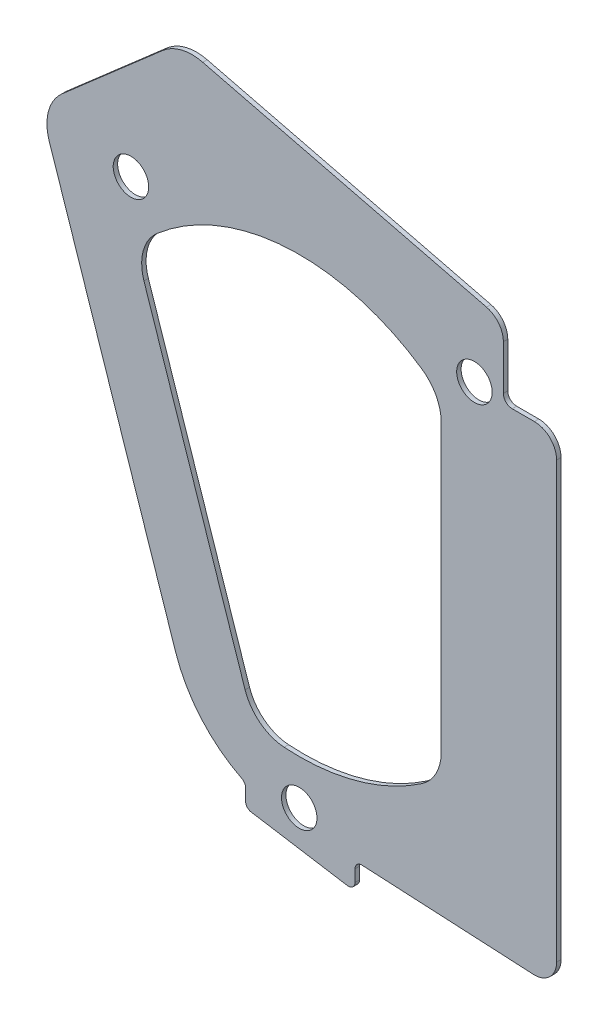
ISO-10303-21;
HEADER;
FILE_DESCRIPTION(('STEP AP214'),'2;1');
FILE_NAME('part.step','',(''),(''),'','','');
FILE_SCHEMA(('AUTOMOTIVE_DESIGN { 1 0 10303 214 1 1 1 1 }'));
ENDSEC;
DATA;
#1=APPLICATION_CONTEXT('core data for automotive mechanical design processes');
#2=APPLICATION_PROTOCOL_DEFINITION('international standard','automotive_design',2000,#1);
#3=PRODUCT_CONTEXT('',#1,'mechanical');
#4=PRODUCT('Part','Part','',(#3));
#5=PRODUCT_RELATED_PRODUCT_CATEGORY('part','',(#4));
#6=PRODUCT_DEFINITION_FORMATION('','',#4);
#7=PRODUCT_DEFINITION_CONTEXT('part definition',#1,'design');
#8=PRODUCT_DEFINITION('design','',#6,#7);
#9=PRODUCT_DEFINITION_SHAPE('','',#8);
#10=(LENGTH_UNIT() NAMED_UNIT(*) SI_UNIT(.MILLI.,.METRE.));
#11=(NAMED_UNIT(*) PLANE_ANGLE_UNIT() SI_UNIT($,.RADIAN.));
#12=(NAMED_UNIT(*) SI_UNIT($,.STERADIAN.) SOLID_ANGLE_UNIT());
#13=UNCERTAINTY_MEASURE_WITH_UNIT(LENGTH_MEASURE(1.E-05),#10,'distance_accuracy_value','');
#14=(GEOMETRIC_REPRESENTATION_CONTEXT(3) GLOBAL_UNCERTAINTY_ASSIGNED_CONTEXT((#13)) GLOBAL_UNIT_ASSIGNED_CONTEXT((#10,
#11,#12)) REPRESENTATION_CONTEXT('',''));
#15=CARTESIAN_POINT('',(0.,0.,0.));
#16=DIRECTION('',(0.,0.,1.));
#17=DIRECTION('',(1.,0.,0.));
#18=AXIS2_PLACEMENT_3D('',#15,#16,#17);
#19=CARTESIAN_POINT('',(0.579585172967806,-32.9763193057377,1.));
#20=DIRECTION('',(0.,0.,1.));
#21=DIRECTION('',(1.,0.,0.));
#22=AXIS2_PLACEMENT_3D('',#19,#20,#21);
#23=PLANE('',#22);
#24=CARTESIAN_POINT('',(-37.9244689715056,45.1966221440199,1.));
#25=DIRECTION('',(0.,0.,1.));
#26=DIRECTION('',(1.,0.,0.));
#27=AXIS2_PLACEMENT_3D('',#24,#25,#26);
#28=CIRCLE('',#27,4.);
#29=CARTESIAN_POINT('',(-33.9244689715056,45.1966221440199,1.));
#30=VERTEX_POINT('',#29);
#31=EDGE_CURVE('E328',#30,#30,#28,.T.);
#32=ORIENTED_EDGE('',*,*,#31,.F.);
#33=EDGE_LOOP('',(#32));
#34=FACE_BOUND('',#33,.T.);
#35=CARTESIAN_POINT('',(0.579585172967806,-32.9763193057377,1.));
#36=DIRECTION('',(0.,0.,1.));
#37=DIRECTION('',(1.,0.,0.));
#38=AXIS2_PLACEMENT_3D('',#35,#36,#37);
#39=CIRCLE('',#38,30.);
#40=CARTESIAN_POINT('',(-27.8813666018187,-42.4617936783389,1.));
#41=VERTEX_POINT('',#40);
#42=CARTESIAN_POINT('',(-12.9237937339093,-59.7654730455875,1.));
#43=VERTEX_POINT('',#42);
#44=EDGE_CURVE('E344',#41,#43,#39,.T.);
#45=ORIENTED_EDGE('',*,*,#44,.T.);
#46=CARTESIAN_POINT('',(-13.5989626792531,-61.10493073258,1.));
#47=DIRECTION('',(0.,0.,-1.));
#48=DIRECTION('',(1.,0.,0.));
#49=AXIS2_PLACEMENT_3D('',#46,#47,#48);
#50=CIRCLE('',#49,1.49999999999999);
#51=CARTESIAN_POINT('',(-12.0989626792531,-61.10493073258,1.));
#52=VERTEX_POINT('',#51);
#53=EDGE_CURVE('E348',#43,#52,#50,.T.);
#54=ORIENTED_EDGE('',*,*,#53,.T.);
#55=DIRECTION('',(0.,-1.,0.));
#56=VECTOR('',#55,1.);
#57=CARTESIAN_POINT('',(-12.0989626792531,-61.10493073258,1.));
#58=LINE('',#57,#56);
#59=CARTESIAN_POINT('',(-12.098962679253,-63.7624567480316,1.));
#60=VERTEX_POINT('',#59);
#61=EDGE_CURVE('E352',#52,#60,#58,.T.);
#62=ORIENTED_EDGE('',*,*,#61,.T.);
#63=CARTESIAN_POINT('',(-10.598962679253,-63.7624567480316,1.));
#64=DIRECTION('',(0.,0.,1.));
#65=DIRECTION('',(1.,0.,0.));
#66=AXIS2_PLACEMENT_3D('',#63,#64,#65);
#67=CIRCLE('',#66,1.50000000000003);
#68=CARTESIAN_POINT('',(-10.838962679253,-65.243132269542,1.));
#69=VERTEX_POINT('',#68);
#70=EDGE_CURVE('E355',#60,#69,#67,.T.);
#71=ORIENTED_EDGE('',*,*,#70,.T.);
#72=DIRECTION('',(0.987117014340245,-0.16,0.));
#73=VECTOR('',#72,1.);
#74=CARTESIAN_POINT('',(-10.838962679253,-65.243132269542,1.));
#75=LINE('',#74,#73);
#76=CARTESIAN_POINT('',(10.8389626792529,-68.756867730458,1.));
#77=VERTEX_POINT('',#76);
#78=EDGE_CURVE('E358',#69,#77,#75,.T.);
#79=ORIENTED_EDGE('',*,*,#78,.T.);
#80=CARTESIAN_POINT('',(11.078962679253,-67.2761922089477,1.));
#81=DIRECTION('',(0.,0.,1.));
#82=DIRECTION('',(1.,0.,0.));
#83=AXIS2_PLACEMENT_3D('',#80,#81,#82);
#84=CIRCLE('',#83,1.50000000000002);
#85=CARTESIAN_POINT('',(12.578962679253,-67.2761922089477,1.));
#86=VERTEX_POINT('',#85);
#87=EDGE_CURVE('E361',#77,#86,#84,.T.);
#88=ORIENTED_EDGE('',*,*,#87,.T.);
#89=DIRECTION('',(0.,1.,0.));
#90=VECTOR('',#89,1.);
#91=CARTESIAN_POINT('',(12.578962679253,-67.2761922089477,1.));
#92=LINE('',#91,#90);
#93=CARTESIAN_POINT('',(12.578962679253,-64.6186661934961,1.));
#94=VERTEX_POINT('',#93);
#95=EDGE_CURVE('E364',#86,#94,#92,.T.);
#96=ORIENTED_EDGE('',*,*,#95,.T.);
#97=CARTESIAN_POINT('',(14.078962679253,-64.6186661934961,1.));
#98=DIRECTION('',(0.,0.,-1.));
#99=DIRECTION('',(-1.,0.,0.));
#100=AXIS2_PLACEMENT_3D('',#97,#98,#99);
#101=CIRCLE('',#100,1.5);
#102=CARTESIAN_POINT('',(14.1566097329633,-63.1206772299019,1.));
#103=VERTEX_POINT('',#102);
#104=EDGE_CURVE('E367',#94,#103,#101,.T.);
#105=ORIENTED_EDGE('',*,*,#104,.T.);
#106=DIRECTION('',(0.998659309062819,-0.0517647024735334,0.));
#107=VECTOR('',#106,1.);
#108=CARTESIAN_POINT('',(14.1566097329633,-63.1206772299019,1.));
#109=LINE('',#108,#107);
#110=CARTESIAN_POINT('',(52.7411764876323,-65.1206772299019,1.));
#111=VERTEX_POINT('',#110);
#112=EDGE_CURVE('E370',#103,#111,#109,.T.);
#113=ORIENTED_EDGE('',*,*,#112,.T.);
#114=CARTESIAN_POINT('',(53.,-60.1273806845878,1.));
#115=DIRECTION('',(0.,0.,1.));
#116=DIRECTION('',(1.,0.,0.));
#117=AXIS2_PLACEMENT_3D('',#114,#115,#116);
#118=CIRCLE('',#117,5.);
#119=CARTESIAN_POINT('',(58.,-60.1273806845878,1.));
#120=VERTEX_POINT('',#119);
#121=EDGE_CURVE('E373',#111,#120,#118,.T.);
#122=ORIENTED_EDGE('',*,*,#121,.T.);
#123=DIRECTION('',(0.,1.,0.));
#124=VECTOR('',#123,1.);
#125=CARTESIAN_POINT('',(58.,-60.1273806845878,1.));
#126=LINE('',#125,#124);
#127=CARTESIAN_POINT('',(58.,37.8793227700981,1.));
#128=VERTEX_POINT('',#127);
#129=EDGE_CURVE('E376',#120,#128,#126,.T.);
#130=ORIENTED_EDGE('',*,*,#129,.T.);
#131=CARTESIAN_POINT('',(53.,37.8793227700981,1.));
#132=DIRECTION('',(0.,0.,1.));
#133=DIRECTION('',(1.,0.,0.));
#134=AXIS2_PLACEMENT_3D('',#131,#132,#133);
#135=CIRCLE('',#134,4.99999999999999);
#136=CARTESIAN_POINT('',(53.,42.8793227700981,1.));
#137=VERTEX_POINT('',#136);
#138=EDGE_CURVE('E379',#128,#137,#135,.T.);
#139=ORIENTED_EDGE('',*,*,#138,.T.);
#140=DIRECTION('',(-1.,0.,0.));
#141=VECTOR('',#140,1.);
#142=CARTESIAN_POINT('',(53.,42.8793227700981,1.));
#143=LINE('',#142,#141);
#144=CARTESIAN_POINT('',(48.,42.8793227700981,1.));
#145=VERTEX_POINT('',#144);
#146=EDGE_CURVE('E382',#137,#145,#143,.T.);
#147=ORIENTED_EDGE('',*,*,#146,.T.);
#148=CARTESIAN_POINT('',(48.,44.8793227700981,1.));
#149=DIRECTION('',(0.,0.,-1.));
#150=DIRECTION('',(-1.,0.,0.));
#151=AXIS2_PLACEMENT_3D('',#148,#149,#150);
#152=CIRCLE('',#151,2.);
#153=CARTESIAN_POINT('',(46.,44.8793227700981,1.));
#154=VERTEX_POINT('',#153);
#155=EDGE_CURVE('E385',#145,#154,#152,.T.);
#156=ORIENTED_EDGE('',*,*,#155,.T.);
#157=DIRECTION('',(0.,1.,0.));
#158=VECTOR('',#157,1.);
#159=CARTESIAN_POINT('',(46.,44.8793227700981,1.));
#160=LINE('',#159,#158);
#161=CARTESIAN_POINT('',(46.,54.9649159638041,1.));
#162=VERTEX_POINT('',#161);
#163=EDGE_CURVE('E388',#154,#162,#160,.T.);
#164=ORIENTED_EDGE('',*,*,#163,.T.);
#165=CARTESIAN_POINT('',(41.,54.9649159638041,1.));
#166=DIRECTION('',(0.,0.,1.));
#167=DIRECTION('',(1.,0.,0.));
#168=AXIS2_PLACEMENT_3D('',#165,#166,#167);
#169=CIRCLE('',#168,4.99999999999999);
#170=CARTESIAN_POINT('',(42.2,59.8187804036087,1.));
#171=VERTEX_POINT('',#170);
#172=EDGE_CURVE('E391',#162,#171,#169,.T.);
#173=ORIENTED_EDGE('',*,*,#172,.T.);
#174=DIRECTION('',(-0.970772887960928,0.24,0.));
#175=VECTOR('',#174,1.);
#176=CARTESIAN_POINT('',(42.2,59.8187804036087,1.));
#177=LINE('',#176,#175);
#178=CARTESIAN_POINT('',(-21.7544428066554,75.6299618487739,1.));
#179=VERTEX_POINT('',#178);
#180=EDGE_CURVE('E394',#171,#179,#177,.T.);
#181=ORIENTED_EDGE('',*,*,#180,.T.);
#182=CARTESIAN_POINT('',(-24.1544428066554,65.9222329691647,1.));
#183=DIRECTION('',(0.,0.,1.));
#184=DIRECTION('',(1.,0.,0.));
#185=AXIS2_PLACEMENT_3D('',#182,#183,#184);
#186=CIRCLE('',#185,10.);
#187=CARTESIAN_POINT('',(-30.7299653165481,73.4563224112866,1.));
#188=VERTEX_POINT('',#187);
#189=EDGE_CURVE('E397',#179,#188,#186,.T.);
#190=ORIENTED_EDGE('',*,*,#189,.T.);
#191=DIRECTION('',(-0.753408944212199,-0.657552250989273,0.));
#192=VECTOR('',#191,1.);
#193=CARTESIAN_POINT('',(-30.7299653165481,73.4563224112866,1.));
#194=LINE('',#193,#192);
#195=CARTESIAN_POINT('',(-53.4342431278338,53.6407241275319,1.));
#196=VERTEX_POINT('',#195);
#197=EDGE_CURVE('E400',#188,#196,#194,.T.);
#198=ORIENTED_EDGE('',*,*,#197,.T.);
#199=CARTESIAN_POINT('',(-46.8587206179411,46.1066346854099,1.));
#200=DIRECTION('',(0.,0.,1.));
#201=DIRECTION('',(1.,0.,0.));
#202=AXIS2_PLACEMENT_3D('',#199,#200,#201);
#203=CIRCLE('',#202,10.);
#204=CARTESIAN_POINT('',(-56.3457045428699,42.9448098945428,1.));
#205=VERTEX_POINT('',#204);
#206=EDGE_CURVE('E403',#196,#205,#203,.T.);
#207=ORIENTED_EDGE('',*,*,#206,.T.);
#208=DIRECTION('',(0.316182479086709,-0.948698392492884,0.));
#209=VECTOR('',#208,1.);
#210=CARTESIAN_POINT('',(-56.3457045428699,42.9448098945428,1.));
#211=LINE('',#210,#209);
#212=EDGE_CURVE('E406',#205,#41,#211,.T.);
#213=ORIENTED_EDGE('',*,*,#212,.T.);
#214=EDGE_LOOP('',(#45,#54,#62,#71,#79,#88,#96,#105,#113,#122,#130,#139,#147,#156,#164,#173,
#181,#190,#198,#207,#213));
#215=FACE_BOUND('',#214,.T.);
#216=CARTESIAN_POINT('',(0.,-59.,1.));
#217=DIRECTION('',(0.,0.,1.));
#218=DIRECTION('',(1.,0.,0.));
#219=AXIS2_PLACEMENT_3D('',#216,#217,#218);
#220=CIRCLE('',#219,4.);
#221=CARTESIAN_POINT('',(4.,-59.,1.));
#222=VERTEX_POINT('',#221);
#223=EDGE_CURVE('E336',#222,#222,#220,.T.);
#224=ORIENTED_EDGE('',*,*,#223,.F.);
#225=EDGE_LOOP('',(#224));
#226=FACE_BOUND('',#225,.T.);
#227=CARTESIAN_POINT('',(39.4787057751724,43.8455447031665,1.));
#228=DIRECTION('',(0.,0.,1.));
#229=DIRECTION('',(1.,0.,0.));
#230=AXIS2_PLACEMENT_3D('',#227,#228,#229);
#231=CIRCLE('',#230,4.00000000000001);
#232=CARTESIAN_POINT('',(43.4787057751724,43.8455447031665,1.));
#233=VERTEX_POINT('',#232);
#234=EDGE_CURVE('E320',#233,#233,#231,.T.);
#235=ORIENTED_EDGE('',*,*,#234,.F.);
#236=EDGE_LOOP('',(#235));
#237=FACE_BOUND('',#236,.T.);
#238=DIRECTION('',(0.,1.,0.));
#239=VECTOR('',#238,1.);
#240=CARTESIAN_POINT('',(32.,32.2024843762092,1.));
#241=LINE('',#240,#239);
#242=CARTESIAN_POINT('',(32.,-32.2024843762092,1.));
#243=VERTEX_POINT('',#242);
#244=CARTESIAN_POINT('',(32.,32.2024843762092,1.));
#245=VERTEX_POINT('',#244);
#246=EDGE_CURVE('E240',#243,#245,#241,.T.);
#247=ORIENTED_EDGE('',*,*,#246,.F.);
#248=CARTESIAN_POINT('',(22.,-32.2024843762092,1.));
#249=DIRECTION('',(0.,0.,1.));
#250=DIRECTION('',(-1.,0.,0.));
#251=AXIS2_PLACEMENT_3D('',#248,#249,#250);
#252=CIRCLE('',#251,10.);
#253=CARTESIAN_POINT('',(27.6410256410257,-40.4595316521603,1.));
#254=VERTEX_POINT('',#253);
#255=EDGE_CURVE('E231',#254,#243,#252,.T.);
#256=ORIENTED_EDGE('',*,*,#255,.F.);
#257=CARTESIAN_POINT('',(0.,0.,1.));
#258=DIRECTION('',(0.,0.,1.));
#259=DIRECTION('',(1.,0.,0.));
#260=AXIS2_PLACEMENT_3D('',#257,#258,#259);
#261=CIRCLE('',#260,49.);
#262=CARTESIAN_POINT('',(-3.41083723846886,-48.8811434945284,1.));
#263=VERTEX_POINT('',#262);
#264=EDGE_CURVE('E272',#263,#254,#261,.T.);
#265=ORIENTED_EDGE('',*,*,#264,.F.);
#266=CARTESIAN_POINT('',(-2.71474800612827,-38.9053999242165,1.));
#267=DIRECTION('',(0.,0.,1.));
#268=DIRECTION('',(1.,0.,0.));
#269=AXIS2_PLACEMENT_3D('',#266,#267,#268);
#270=CIRCLE('',#269,10.);
#271=CARTESIAN_POINT('',(-12.2017319310571,-42.0672247150835,1.));
#272=VERTEX_POINT('',#271);
#273=EDGE_CURVE('E269',#272,#263,#270,.T.);
#274=ORIENTED_EDGE('',*,*,#273,.F.);
#275=DIRECTION('',(0.316182479086709,-0.948698392492884,0.));
#276=VECTOR('',#275,1.);
#277=CARTESIAN_POINT('',(-34.9992061625363,26.3360821941874,1.));
#278=LINE('',#277,#276);
#279=CARTESIAN_POINT('',(-34.9992061625363,26.3360821941874,1.));
#280=VERTEX_POINT('',#279);
#281=EDGE_CURVE('E266',#280,#272,#278,.T.);
#282=ORIENTED_EDGE('',*,*,#281,.F.);
#283=CARTESIAN_POINT('',(-25.5122222376075,29.4979069850545,1.));
#284=DIRECTION('',(0.,0.,1.));
#285=DIRECTION('',(-1.,0.,0.));
#286=AXIS2_PLACEMENT_3D('',#283,#284,#285);
#287=CIRCLE('',#286,10.);
#288=CARTESIAN_POINT('',(-32.0538176831478,37.0614728786582,1.));
#289=VERTEX_POINT('',#288);
#290=EDGE_CURVE('E263',#289,#280,#287,.T.);
#291=ORIENTED_EDGE('',*,*,#290,.F.);
#292=CARTESIAN_POINT('',(0.,0.,1.));
#293=DIRECTION('',(0.,0.,1.));
#294=DIRECTION('',(1.,0.,0.));
#295=AXIS2_PLACEMENT_3D('',#292,#293,#294);
#296=CIRCLE('',#295,49.);
#297=CARTESIAN_POINT('',(27.6410256410256,40.4595316521603,1.));
#298=VERTEX_POINT('',#297);
#299=EDGE_CURVE('E258',#298,#289,#296,.T.);
#300=ORIENTED_EDGE('',*,*,#299,.F.);
#301=CARTESIAN_POINT('',(22.,32.2024843762092,1.));
#302=DIRECTION('',(0.,0.,1.));
#303=DIRECTION('',(1.,0.,0.));
#304=AXIS2_PLACEMENT_3D('',#301,#302,#303);
#305=CIRCLE('',#304,10.);
#306=EDGE_CURVE('E254',#245,#298,#305,.T.);
#307=ORIENTED_EDGE('',*,*,#306,.F.);
#308=EDGE_LOOP('',(#247,#256,#265,#274,#282,#291,#300,#307));
#309=FACE_BOUND('',#308,.T.);
#310=ADVANCED_FACE('F39',(#34,#215,#226,#237,#309),#23,.T.);
#311=CARTESIAN_POINT('',(0.579585172967806,-32.9763193057377,0.));
#312=DIRECTION('',(0.,0.,1.));
#313=DIRECTION('',(1.,0.,0.));
#314=AXIS2_PLACEMENT_3D('',#311,#312,#313);
#315=PLANE('',#314);
#316=CARTESIAN_POINT('',(39.4787057751724,43.8455447031665,0.));
#317=DIRECTION('',(0.,0.,1.));
#318=DIRECTION('',(1.,0.,0.));
#319=AXIS2_PLACEMENT_3D('',#316,#317,#318);
#320=CIRCLE('',#319,4.00000000000001);
#321=CARTESIAN_POINT('',(43.4787057751724,43.8455447031665,0.));
#322=VERTEX_POINT('',#321);
#323=EDGE_CURVE('E249',#322,#322,#320,.T.);
#324=ORIENTED_EDGE('',*,*,#323,.T.);
#325=EDGE_LOOP('',(#324));
#326=FACE_BOUND('',#325,.T.);
#327=CARTESIAN_POINT('',(-37.9244689715056,45.1966221440199,0.));
#328=DIRECTION('',(0.,0.,1.));
#329=DIRECTION('',(1.,0.,0.));
#330=AXIS2_PLACEMENT_3D('',#327,#328,#329);
#331=CIRCLE('',#330,4.);
#332=CARTESIAN_POINT('',(-33.9244689715056,45.1966221440199,0.));
#333=VERTEX_POINT('',#332);
#334=EDGE_CURVE('E324',#333,#333,#331,.T.);
#335=ORIENTED_EDGE('',*,*,#334,.T.);
#336=EDGE_LOOP('',(#335));
#337=FACE_BOUND('',#336,.T.);
#338=CARTESIAN_POINT('',(0.,-59.,0.));
#339=DIRECTION('',(0.,0.,1.));
#340=DIRECTION('',(1.,0.,0.));
#341=AXIS2_PLACEMENT_3D('',#338,#339,#340);
#342=CIRCLE('',#341,4.);
#343=CARTESIAN_POINT('',(4.,-59.,0.));
#344=VERTEX_POINT('',#343);
#345=EDGE_CURVE('E332',#344,#344,#342,.T.);
#346=ORIENTED_EDGE('',*,*,#345,.T.);
#347=EDGE_LOOP('',(#346));
#348=FACE_BOUND('',#347,.T.);
#349=CARTESIAN_POINT('',(0.579585172967806,-32.9763193057377,0.));
#350=DIRECTION('',(0.,0.,1.));
#351=DIRECTION('',(1.,0.,0.));
#352=AXIS2_PLACEMENT_3D('',#349,#350,#351);
#353=CIRCLE('',#352,30.);
#354=CARTESIAN_POINT('',(-27.8813666018187,-42.4617936783389,0.));
#355=VERTEX_POINT('',#354);
#356=CARTESIAN_POINT('',(-12.9237937339093,-59.7654730455875,0.));
#357=VERTEX_POINT('',#356);
#358=EDGE_CURVE('E340',#355,#357,#353,.T.);
#359=ORIENTED_EDGE('',*,*,#358,.F.);
#360=DIRECTION('',(0.316182479086709,-0.948698392492884,0.));
#361=VECTOR('',#360,1.);
#362=CARTESIAN_POINT('',(-56.3457045428699,42.9448098945428,0.));
#363=LINE('',#362,#361);
#364=CARTESIAN_POINT('',(-56.3457045428699,42.9448098945428,0.));
#365=VERTEX_POINT('',#364);
#366=EDGE_CURVE('E349',#365,#355,#363,.T.);
#367=ORIENTED_EDGE('',*,*,#366,.F.);
#368=CARTESIAN_POINT('',(-46.8587206179411,46.1066346854099,0.));
#369=DIRECTION('',(0.,0.,1.));
#370=DIRECTION('',(1.,0.,0.));
#371=AXIS2_PLACEMENT_3D('',#368,#369,#370);
#372=CIRCLE('',#371,10.);
#373=CARTESIAN_POINT('',(-53.4342431278338,53.6407241275319,0.));
#374=VERTEX_POINT('',#373);
#375=EDGE_CURVE('E467',#374,#365,#372,.T.);
#376=ORIENTED_EDGE('',*,*,#375,.F.);
#377=DIRECTION('',(-0.753408944212199,-0.657552250989273,0.));
#378=VECTOR('',#377,1.);
#379=CARTESIAN_POINT('',(-30.7299653165481,73.4563224112866,0.));
#380=LINE('',#379,#378);
#381=CARTESIAN_POINT('',(-30.7299653165481,73.4563224112866,0.));
#382=VERTEX_POINT('',#381);
#383=EDGE_CURVE('E464',#382,#374,#380,.T.);
#384=ORIENTED_EDGE('',*,*,#383,.F.);
#385=CARTESIAN_POINT('',(-24.1544428066554,65.9222329691647,0.));
#386=DIRECTION('',(0.,0.,1.));
#387=DIRECTION('',(1.,0.,0.));
#388=AXIS2_PLACEMENT_3D('',#385,#386,#387);
#389=CIRCLE('',#388,10.);
#390=CARTESIAN_POINT('',(-21.7544428066554,75.6299618487739,0.));
#391=VERTEX_POINT('',#390);
#392=EDGE_CURVE('E461',#391,#382,#389,.T.);
#393=ORIENTED_EDGE('',*,*,#392,.F.);
#394=DIRECTION('',(-0.970772887960928,0.24,0.));
#395=VECTOR('',#394,1.);
#396=CARTESIAN_POINT('',(42.2,59.8187804036087,0.));
#397=LINE('',#396,#395);
#398=CARTESIAN_POINT('',(42.2,59.8187804036087,0.));
#399=VERTEX_POINT('',#398);
#400=EDGE_CURVE('E458',#399,#391,#397,.T.);
#401=ORIENTED_EDGE('',*,*,#400,.F.);
#402=CARTESIAN_POINT('',(41.,54.9649159638041,0.));
#403=DIRECTION('',(0.,0.,1.));
#404=DIRECTION('',(1.,0.,0.));
#405=AXIS2_PLACEMENT_3D('',#402,#403,#404);
#406=CIRCLE('',#405,4.99999999999999);
#407=CARTESIAN_POINT('',(46.,54.9649159638041,0.));
#408=VERTEX_POINT('',#407);
#409=EDGE_CURVE('E455',#408,#399,#406,.T.);
#410=ORIENTED_EDGE('',*,*,#409,.F.);
#411=DIRECTION('',(0.,1.,0.));
#412=VECTOR('',#411,1.);
#413=CARTESIAN_POINT('',(46.,44.8793227700981,0.));
#414=LINE('',#413,#412);
#415=CARTESIAN_POINT('',(46.,44.8793227700981,0.));
#416=VERTEX_POINT('',#415);
#417=EDGE_CURVE('E452',#416,#408,#414,.T.);
#418=ORIENTED_EDGE('',*,*,#417,.F.);
#419=CARTESIAN_POINT('',(48.,44.8793227700981,0.));
#420=DIRECTION('',(0.,0.,-1.));
#421=DIRECTION('',(-1.,0.,0.));
#422=AXIS2_PLACEMENT_3D('',#419,#420,#421);
#423=CIRCLE('',#422,2.);
#424=CARTESIAN_POINT('',(48.,42.8793227700981,0.));
#425=VERTEX_POINT('',#424);
#426=EDGE_CURVE('E449',#425,#416,#423,.T.);
#427=ORIENTED_EDGE('',*,*,#426,.F.);
#428=DIRECTION('',(-1.,0.,0.));
#429=VECTOR('',#428,1.);
#430=CARTESIAN_POINT('',(53.,42.8793227700981,0.));
#431=LINE('',#430,#429);
#432=CARTESIAN_POINT('',(53.,42.8793227700981,0.));
#433=VERTEX_POINT('',#432);
#434=EDGE_CURVE('E446',#433,#425,#431,.T.);
#435=ORIENTED_EDGE('',*,*,#434,.F.);
#436=CARTESIAN_POINT('',(53.,37.8793227700981,0.));
#437=DIRECTION('',(0.,0.,1.));
#438=DIRECTION('',(1.,0.,0.));
#439=AXIS2_PLACEMENT_3D('',#436,#437,#438);
#440=CIRCLE('',#439,4.99999999999999);
#441=CARTESIAN_POINT('',(58.,37.8793227700981,0.));
#442=VERTEX_POINT('',#441);
#443=EDGE_CURVE('E443',#442,#433,#440,.T.);
#444=ORIENTED_EDGE('',*,*,#443,.F.);
#445=DIRECTION('',(0.,1.,0.));
#446=VECTOR('',#445,1.);
#447=CARTESIAN_POINT('',(58.,-60.1273806845878,0.));
#448=LINE('',#447,#446);
#449=CARTESIAN_POINT('',(58.,-60.1273806845878,0.));
#450=VERTEX_POINT('',#449);
#451=EDGE_CURVE('E440',#450,#442,#448,.T.);
#452=ORIENTED_EDGE('',*,*,#451,.F.);
#453=CARTESIAN_POINT('',(53.,-60.1273806845878,0.));
#454=DIRECTION('',(0.,0.,1.));
#455=DIRECTION('',(1.,0.,0.));
#456=AXIS2_PLACEMENT_3D('',#453,#454,#455);
#457=CIRCLE('',#456,5.);
#458=CARTESIAN_POINT('',(52.7411764876323,-65.1206772299019,0.));
#459=VERTEX_POINT('',#458);
#460=EDGE_CURVE('E437',#459,#450,#457,.T.);
#461=ORIENTED_EDGE('',*,*,#460,.F.);
#462=DIRECTION('',(0.998659309062819,-0.0517647024735334,0.));
#463=VECTOR('',#462,1.);
#464=CARTESIAN_POINT('',(14.1566097329633,-63.1206772299019,0.));
#465=LINE('',#464,#463);
#466=CARTESIAN_POINT('',(14.1566097329633,-63.1206772299019,0.));
#467=VERTEX_POINT('',#466);
#468=EDGE_CURVE('E434',#467,#459,#465,.T.);
#469=ORIENTED_EDGE('',*,*,#468,.F.);
#470=CARTESIAN_POINT('',(14.078962679253,-64.6186661934961,0.));
#471=DIRECTION('',(0.,0.,-1.));
#472=DIRECTION('',(-1.,0.,0.));
#473=AXIS2_PLACEMENT_3D('',#470,#471,#472);
#474=CIRCLE('',#473,1.5);
#475=CARTESIAN_POINT('',(12.578962679253,-64.6186661934961,0.));
#476=VERTEX_POINT('',#475);
#477=EDGE_CURVE('E431',#476,#467,#474,.T.);
#478=ORIENTED_EDGE('',*,*,#477,.F.);
#479=DIRECTION('',(0.,1.,0.));
#480=VECTOR('',#479,1.);
#481=CARTESIAN_POINT('',(12.578962679253,-67.2761922089477,0.));
#482=LINE('',#481,#480);
#483=CARTESIAN_POINT('',(12.578962679253,-67.2761922089477,0.));
#484=VERTEX_POINT('',#483);
#485=EDGE_CURVE('E428',#484,#476,#482,.T.);
#486=ORIENTED_EDGE('',*,*,#485,.F.);
#487=CARTESIAN_POINT('',(11.078962679253,-67.2761922089477,0.));
#488=DIRECTION('',(0.,0.,1.));
#489=DIRECTION('',(1.,0.,0.));
#490=AXIS2_PLACEMENT_3D('',#487,#488,#489);
#491=CIRCLE('',#490,1.50000000000002);
#492=CARTESIAN_POINT('',(10.8389626792529,-68.756867730458,0.));
#493=VERTEX_POINT('',#492);
#494=EDGE_CURVE('E425',#493,#484,#491,.T.);
#495=ORIENTED_EDGE('',*,*,#494,.F.);
#496=DIRECTION('',(0.987117014340245,-0.16,0.));
#497=VECTOR('',#496,1.);
#498=CARTESIAN_POINT('',(-10.838962679253,-65.243132269542,0.));
#499=LINE('',#498,#497);
#500=CARTESIAN_POINT('',(-10.838962679253,-65.243132269542,0.));
#501=VERTEX_POINT('',#500);
#502=EDGE_CURVE('E422',#501,#493,#499,.T.);
#503=ORIENTED_EDGE('',*,*,#502,.F.);
#504=CARTESIAN_POINT('',(-10.598962679253,-63.7624567480316,0.));
#505=DIRECTION('',(0.,0.,1.));
#506=DIRECTION('',(1.,0.,0.));
#507=AXIS2_PLACEMENT_3D('',#504,#505,#506);
#508=CIRCLE('',#507,1.50000000000003);
#509=CARTESIAN_POINT('',(-12.098962679253,-63.7624567480316,0.));
#510=VERTEX_POINT('',#509);
#511=EDGE_CURVE('E419',#510,#501,#508,.T.);
#512=ORIENTED_EDGE('',*,*,#511,.F.);
#513=DIRECTION('',(0.,-1.,0.));
#514=VECTOR('',#513,1.);
#515=CARTESIAN_POINT('',(-12.0989626792531,-61.10493073258,0.));
#516=LINE('',#515,#514);
#517=CARTESIAN_POINT('',(-12.0989626792531,-61.10493073258,0.));
#518=VERTEX_POINT('',#517);
#519=EDGE_CURVE('E416',#518,#510,#516,.T.);
#520=ORIENTED_EDGE('',*,*,#519,.F.);
#521=CARTESIAN_POINT('',(-13.5989626792531,-61.10493073258,0.));
#522=DIRECTION('',(0.,0.,-1.));
#523=DIRECTION('',(1.,0.,0.));
#524=AXIS2_PLACEMENT_3D('',#521,#522,#523);
#525=CIRCLE('',#524,1.49999999999999);
#526=EDGE_CURVE('E413',#357,#518,#525,.T.);
#527=ORIENTED_EDGE('',*,*,#526,.F.);
#528=EDGE_LOOP('',(#359,#367,#376,#384,#393,#401,#410,#418,#427,#435,#444,#452,#461,#469,#478,
#486,#495,#503,#512,#520,#527));
#529=FACE_BOUND('',#528,.T.);
#530=CARTESIAN_POINT('',(22.,-32.2024843762092,0.));
#531=DIRECTION('',(0.,0.,1.));
#532=DIRECTION('',(-1.,0.,0.));
#533=AXIS2_PLACEMENT_3D('',#530,#531,#532);
#534=CIRCLE('',#533,10.);
#535=CARTESIAN_POINT('',(27.6410256410257,-40.4595316521603,0.));
#536=VERTEX_POINT('',#535);
#537=CARTESIAN_POINT('',(32.,-32.2024843762092,0.));
#538=VERTEX_POINT('',#537);
#539=EDGE_CURVE('E63',#536,#538,#534,.T.);
#540=ORIENTED_EDGE('',*,*,#539,.T.);
#541=DIRECTION('',(0.,1.,0.));
#542=VECTOR('',#541,1.);
#543=CARTESIAN_POINT('',(32.,32.2024843762092,0.));
#544=LINE('',#543,#542);
#545=CARTESIAN_POINT('',(32.,32.2024843762092,0.));
#546=VERTEX_POINT('',#545);
#547=EDGE_CURVE('E247',#538,#546,#544,.T.);
#548=ORIENTED_EDGE('',*,*,#547,.T.);
#549=CARTESIAN_POINT('',(22.,32.2024843762092,0.));
#550=DIRECTION('',(0.,0.,1.));
#551=DIRECTION('',(1.,0.,0.));
#552=AXIS2_PLACEMENT_3D('',#549,#550,#551);
#553=CIRCLE('',#552,10.);
#554=CARTESIAN_POINT('',(27.6410256410256,40.4595316521603,0.));
#555=VERTEX_POINT('',#554);
#556=EDGE_CURVE('E279',#546,#555,#553,.T.);
#557=ORIENTED_EDGE('',*,*,#556,.T.);
#558=CARTESIAN_POINT('',(0.,0.,0.));
#559=DIRECTION('',(0.,0.,1.));
#560=DIRECTION('',(1.,0.,0.));
#561=AXIS2_PLACEMENT_3D('',#558,#559,#560);
#562=CIRCLE('',#561,49.);
#563=CARTESIAN_POINT('',(-32.0538176831478,37.0614728786582,0.));
#564=VERTEX_POINT('',#563);
#565=EDGE_CURVE('E283',#555,#564,#562,.T.);
#566=ORIENTED_EDGE('',*,*,#565,.T.);
#567=CARTESIAN_POINT('',(-25.5122222376075,29.4979069850545,0.));
#568=DIRECTION('',(0.,0.,1.));
#569=DIRECTION('',(-1.,0.,0.));
#570=AXIS2_PLACEMENT_3D('',#567,#568,#569);
#571=CIRCLE('',#570,10.);
#572=CARTESIAN_POINT('',(-34.9992061625363,26.3360821941874,0.));
#573=VERTEX_POINT('',#572);
#574=EDGE_CURVE('E287',#564,#573,#571,.T.);
#575=ORIENTED_EDGE('',*,*,#574,.T.);
#576=DIRECTION('',(0.316182479086709,-0.948698392492884,0.));
#577=VECTOR('',#576,1.);
#578=CARTESIAN_POINT('',(-34.9992061625363,26.3360821941874,0.));
#579=LINE('',#578,#577);
#580=CARTESIAN_POINT('',(-12.2017319310571,-42.0672247150835,0.));
#581=VERTEX_POINT('',#580);
#582=EDGE_CURVE('E291',#573,#581,#579,.T.);
#583=ORIENTED_EDGE('',*,*,#582,.T.);
#584=CARTESIAN_POINT('',(-2.71474800612827,-38.9053999242165,0.));
#585=DIRECTION('',(0.,0.,1.));
#586=DIRECTION('',(1.,0.,0.));
#587=AXIS2_PLACEMENT_3D('',#584,#585,#586);
#588=CIRCLE('',#587,10.);
#589=CARTESIAN_POINT('',(-3.41083723846886,-48.8811434945284,0.));
#590=VERTEX_POINT('',#589);
#591=EDGE_CURVE('E295',#581,#590,#588,.T.);
#592=ORIENTED_EDGE('',*,*,#591,.T.);
#593=CARTESIAN_POINT('',(0.,0.,0.));
#594=DIRECTION('',(0.,0.,1.));
#595=DIRECTION('',(1.,0.,0.));
#596=AXIS2_PLACEMENT_3D('',#593,#594,#595);
#597=CIRCLE('',#596,49.);
#598=EDGE_CURVE('E241',#590,#536,#597,.T.);
#599=ORIENTED_EDGE('',*,*,#598,.T.);
#600=EDGE_LOOP('',(#540,#548,#557,#566,#575,#583,#592,#599));
#601=FACE_BOUND('',#600,.T.);
#602=ADVANCED_FACE('F558',(#326,#337,#348,#529,#601),#315,.F.);
#603=CARTESIAN_POINT('',(0.579585172967806,-32.9763193057377,1.));
#604=DIRECTION('',(0.,0.,-1.));
#605=DIRECTION('',(-1.,0.,0.));
#606=AXIS2_PLACEMENT_3D('',#603,#604,#605);
#607=CYLINDRICAL_SURFACE('',#606,30.);
#608=ORIENTED_EDGE('',*,*,#358,.T.);
#609=DIRECTION('',(0.,0.,-1.));
#610=VECTOR('',#609,1.);
#611=CARTESIAN_POINT('',(-12.9237937339093,-59.7654730455875,1.));
#612=LINE('',#611,#610);
#613=EDGE_CURVE('E11',#43,#357,#612,.T.);
#614=ORIENTED_EDGE('',*,*,#613,.F.);
#615=ORIENTED_EDGE('',*,*,#44,.F.);
#616=DIRECTION('',(0.,0.,-1.));
#617=VECTOR('',#616,1.);
#618=CARTESIAN_POINT('',(-27.8813666018187,-42.4617936783389,1.));
#619=LINE('',#618,#617);
#620=EDGE_CURVE('E409',#41,#355,#619,.T.);
#621=ORIENTED_EDGE('',*,*,#620,.T.);
#622=EDGE_LOOP('',(#608,#614,#615,#621));
#623=FACE_BOUND('',#622,.T.);
#624=ADVANCED_FACE('F41',(#623),#607,.T.);
#625=CARTESIAN_POINT('',(-13.5989626792531,-61.10493073258,1.));
#626=DIRECTION('',(0.,0.,-1.));
#627=DIRECTION('',(-1.,0.,0.));
#628=AXIS2_PLACEMENT_3D('',#625,#626,#627);
#629=CYLINDRICAL_SURFACE('',#628,1.49999999999999);
#630=ORIENTED_EDGE('',*,*,#526,.T.);
#631=DIRECTION('',(0.,0.,-1.));
#632=VECTOR('',#631,1.);
#633=CARTESIAN_POINT('',(-12.0989626792531,-61.10493073258,1.));
#634=LINE('',#633,#632);
#635=EDGE_CURVE('E48',#52,#518,#634,.T.);
#636=ORIENTED_EDGE('',*,*,#635,.F.);
#637=ORIENTED_EDGE('',*,*,#53,.F.);
#638=ORIENTED_EDGE('',*,*,#613,.T.);
#639=EDGE_LOOP('',(#630,#636,#637,#638));
#640=FACE_BOUND('',#639,.T.);
#641=ADVANCED_FACE('F576',(#640),#629,.F.);
#642=CARTESIAN_POINT('',(-12.0989626792531,-61.10493073258,1.));
#643=DIRECTION('',(1.,0.,0.));
#644=DIRECTION('',(0.,1.,0.));
#645=AXIS2_PLACEMENT_3D('',#642,#643,#644);
#646=PLANE('',#645);
#647=ORIENTED_EDGE('',*,*,#519,.T.);
#648=DIRECTION('',(0.,0.,-1.));
#649=VECTOR('',#648,1.);
#650=CARTESIAN_POINT('',(-12.098962679253,-63.7624567480316,1.));
#651=LINE('',#650,#649);
#652=EDGE_CURVE('E543',#60,#510,#651,.T.);
#653=ORIENTED_EDGE('',*,*,#652,.F.);
#654=ORIENTED_EDGE('',*,*,#61,.F.);
#655=ORIENTED_EDGE('',*,*,#635,.T.);
#656=EDGE_LOOP('',(#647,#653,#654,#655));
#657=FACE_BOUND('',#656,.T.);
#658=ADVANCED_FACE('F552',(#657),#646,.F.);
#659=CARTESIAN_POINT('',(-10.598962679253,-63.7624567480316,1.));
#660=DIRECTION('',(0.,0.,-1.));
#661=DIRECTION('',(-1.,0.,0.));
#662=AXIS2_PLACEMENT_3D('',#659,#660,#661);
#663=CYLINDRICAL_SURFACE('',#662,1.50000000000003);
#664=ORIENTED_EDGE('',*,*,#511,.T.);
#665=DIRECTION('',(0.,0.,-1.));
#666=VECTOR('',#665,1.);
#667=CARTESIAN_POINT('',(-10.838962679253,-65.243132269542,1.));
#668=LINE('',#667,#666);
#669=EDGE_CURVE('E539',#69,#501,#668,.T.);
#670=ORIENTED_EDGE('',*,*,#669,.F.);
#671=ORIENTED_EDGE('',*,*,#70,.F.);
#672=ORIENTED_EDGE('',*,*,#652,.T.);
#673=EDGE_LOOP('',(#664,#670,#671,#672));
#674=FACE_BOUND('',#673,.T.);
#675=ADVANCED_FACE('F564',(#674),#663,.T.);
#676=CARTESIAN_POINT('',(-10.838962679253,-65.243132269542,1.));
#677=DIRECTION('',(0.16,0.987117014340245,0.));
#678=DIRECTION('',(-0.987117014340245,0.16,0.));
#679=AXIS2_PLACEMENT_3D('',#676,#677,#678);
#680=PLANE('',#679);
#681=ORIENTED_EDGE('',*,*,#502,.T.);
#682=DIRECTION('',(0.,0.,-1.));
#683=VECTOR('',#682,1.);
#684=CARTESIAN_POINT('',(10.8389626792529,-68.756867730458,1.));
#685=LINE('',#684,#683);
#686=EDGE_CURVE('E535',#77,#493,#685,.T.);
#687=ORIENTED_EDGE('',*,*,#686,.F.);
#688=ORIENTED_EDGE('',*,*,#78,.F.);
#689=ORIENTED_EDGE('',*,*,#669,.T.);
#690=EDGE_LOOP('',(#681,#687,#688,#689));
#691=FACE_BOUND('',#690,.T.);
#692=ADVANCED_FACE('F568',(#691),#680,.F.);
#693=CARTESIAN_POINT('',(11.078962679253,-67.2761922089477,1.));
#694=DIRECTION('',(0.,0.,-1.));
#695=DIRECTION('',(-1.,0.,0.));
#696=AXIS2_PLACEMENT_3D('',#693,#694,#695);
#697=CYLINDRICAL_SURFACE('',#696,1.50000000000002);
#698=ORIENTED_EDGE('',*,*,#494,.T.);
#699=DIRECTION('',(0.,0.,-1.));
#700=VECTOR('',#699,1.);
#701=CARTESIAN_POINT('',(12.578962679253,-67.2761922089477,1.));
#702=LINE('',#701,#700);
#703=EDGE_CURVE('E531',#86,#484,#702,.T.);
#704=ORIENTED_EDGE('',*,*,#703,.F.);
#705=ORIENTED_EDGE('',*,*,#87,.F.);
#706=ORIENTED_EDGE('',*,*,#686,.T.);
#707=EDGE_LOOP('',(#698,#704,#705,#706));
#708=FACE_BOUND('',#707,.T.);
#709=ADVANCED_FACE('F654',(#708),#697,.T.);
#710=CARTESIAN_POINT('',(12.578962679253,-67.2761922089477,1.));
#711=DIRECTION('',(-1.,0.,0.));
#712=DIRECTION('',(0.,0.,1.));
#713=AXIS2_PLACEMENT_3D('',#710,#711,#712);
#714=PLANE('',#713);
#715=ORIENTED_EDGE('',*,*,#485,.T.);
#716=DIRECTION('',(0.,0.,-1.));
#717=VECTOR('',#716,1.);
#718=CARTESIAN_POINT('',(12.578962679253,-64.6186661934961,1.));
#719=LINE('',#718,#717);
#720=EDGE_CURVE('E527',#94,#476,#719,.T.);
#721=ORIENTED_EDGE('',*,*,#720,.F.);
#722=ORIENTED_EDGE('',*,*,#95,.F.);
#723=ORIENTED_EDGE('',*,*,#703,.T.);
#724=EDGE_LOOP('',(#715,#721,#722,#723));
#725=FACE_BOUND('',#724,.T.);
#726=ADVANCED_FACE('F652',(#725),#714,.F.);
#727=CARTESIAN_POINT('',(14.078962679253,-64.6186661934961,1.));
#728=DIRECTION('',(0.,0.,-1.));
#729=DIRECTION('',(-1.,0.,0.));
#730=AXIS2_PLACEMENT_3D('',#727,#728,#729);
#731=CYLINDRICAL_SURFACE('',#730,1.5);
#732=ORIENTED_EDGE('',*,*,#477,.T.);
#733=DIRECTION('',(0.,0.,-1.));
#734=VECTOR('',#733,1.);
#735=CARTESIAN_POINT('',(14.1566097329633,-63.1206772299019,1.));
#736=LINE('',#735,#734);
#737=EDGE_CURVE('E523',#103,#467,#736,.T.);
#738=ORIENTED_EDGE('',*,*,#737,.F.);
#739=ORIENTED_EDGE('',*,*,#104,.F.);
#740=ORIENTED_EDGE('',*,*,#720,.T.);
#741=EDGE_LOOP('',(#732,#738,#739,#740));
#742=FACE_BOUND('',#741,.T.);
#743=ADVANCED_FACE('F648',(#742),#731,.F.);
#744=CARTESIAN_POINT('',(14.1566097329633,-63.1206772299019,1.));
#745=DIRECTION('',(0.0517647024735334,0.998659309062819,0.));
#746=DIRECTION('',(-0.998659309062819,0.0517647024735334,0.));
#747=AXIS2_PLACEMENT_3D('',#744,#745,#746);
#748=PLANE('',#747);
#749=ORIENTED_EDGE('',*,*,#468,.T.);
#750=DIRECTION('',(0.,0.,-1.));
#751=VECTOR('',#750,1.);
#752=CARTESIAN_POINT('',(52.7411764876323,-65.1206772299019,1.));
#753=LINE('',#752,#751);
#754=EDGE_CURVE('E519',#111,#459,#753,.T.);
#755=ORIENTED_EDGE('',*,*,#754,.F.);
#756=ORIENTED_EDGE('',*,*,#112,.F.);
#757=ORIENTED_EDGE('',*,*,#737,.T.);
#758=EDGE_LOOP('',(#749,#755,#756,#757));
#759=FACE_BOUND('',#758,.T.);
#760=ADVANCED_FACE('F643',(#759),#748,.F.);
#761=CARTESIAN_POINT('',(53.,-60.1273806845878,1.));
#762=DIRECTION('',(0.,0.,-1.));
#763=DIRECTION('',(-1.,0.,0.));
#764=AXIS2_PLACEMENT_3D('',#761,#762,#763);
#765=CYLINDRICAL_SURFACE('',#764,5.);
#766=ORIENTED_EDGE('',*,*,#460,.T.);
#767=DIRECTION('',(0.,0.,-1.));
#768=VECTOR('',#767,1.);
#769=CARTESIAN_POINT('',(58.,-60.1273806845878,1.));
#770=LINE('',#769,#768);
#771=EDGE_CURVE('E515',#120,#450,#770,.T.);
#772=ORIENTED_EDGE('',*,*,#771,.F.);
#773=ORIENTED_EDGE('',*,*,#121,.F.);
#774=ORIENTED_EDGE('',*,*,#754,.T.);
#775=EDGE_LOOP('',(#766,#772,#773,#774));
#776=FACE_BOUND('',#775,.T.);
#777=ADVANCED_FACE('F637',(#776),#765,.T.);
#778=CARTESIAN_POINT('',(58.,-60.1273806845878,1.));
#779=DIRECTION('',(-1.,0.,0.));
#780=DIRECTION('',(0.,-1.,0.));
#781=AXIS2_PLACEMENT_3D('',#778,#779,#780);
#782=PLANE('',#781);
#783=ORIENTED_EDGE('',*,*,#451,.T.);
#784=DIRECTION('',(0.,0.,-1.));
#785=VECTOR('',#784,1.);
#786=CARTESIAN_POINT('',(58.,37.8793227700981,1.));
#787=LINE('',#786,#785);
#788=EDGE_CURVE('E511',#128,#442,#787,.T.);
#789=ORIENTED_EDGE('',*,*,#788,.F.);
#790=ORIENTED_EDGE('',*,*,#129,.F.);
#791=ORIENTED_EDGE('',*,*,#771,.T.);
#792=EDGE_LOOP('',(#783,#789,#790,#791));
#793=FACE_BOUND('',#792,.T.);
#794=ADVANCED_FACE('F633',(#793),#782,.F.);
#795=CARTESIAN_POINT('',(53.,37.8793227700981,1.));
#796=DIRECTION('',(0.,0.,-1.));
#797=DIRECTION('',(-1.,0.,0.));
#798=AXIS2_PLACEMENT_3D('',#795,#796,#797);
#799=CYLINDRICAL_SURFACE('',#798,4.99999999999999);
#800=ORIENTED_EDGE('',*,*,#443,.T.);
#801=DIRECTION('',(0.,0.,-1.));
#802=VECTOR('',#801,1.);
#803=CARTESIAN_POINT('',(53.,42.8793227700981,1.));
#804=LINE('',#803,#802);
#805=EDGE_CURVE('E507',#137,#433,#804,.T.);
#806=ORIENTED_EDGE('',*,*,#805,.F.);
#807=ORIENTED_EDGE('',*,*,#138,.F.);
#808=ORIENTED_EDGE('',*,*,#788,.T.);
#809=EDGE_LOOP('',(#800,#806,#807,#808));
#810=FACE_BOUND('',#809,.T.);
#811=ADVANCED_FACE('F628',(#810),#799,.T.);
#812=CARTESIAN_POINT('',(53.,42.8793227700981,1.));
#813=DIRECTION('',(0.,-1.,0.));
#814=DIRECTION('',(1.,0.,0.));
#815=AXIS2_PLACEMENT_3D('',#812,#813,#814);
#816=PLANE('',#815);
#817=ORIENTED_EDGE('',*,*,#434,.T.);
#818=DIRECTION('',(0.,0.,-1.));
#819=VECTOR('',#818,1.);
#820=CARTESIAN_POINT('',(48.,42.8793227700981,1.));
#821=LINE('',#820,#819);
#822=EDGE_CURVE('E503',#145,#425,#821,.T.);
#823=ORIENTED_EDGE('',*,*,#822,.F.);
#824=ORIENTED_EDGE('',*,*,#146,.F.);
#825=ORIENTED_EDGE('',*,*,#805,.T.);
#826=EDGE_LOOP('',(#817,#823,#824,#825));
#827=FACE_BOUND('',#826,.T.);
#828=ADVANCED_FACE('F622',(#827),#816,.F.);
#829=CARTESIAN_POINT('',(48.,44.8793227700981,1.));
#830=DIRECTION('',(0.,0.,-1.));
#831=DIRECTION('',(-1.,0.,0.));
#832=AXIS2_PLACEMENT_3D('',#829,#830,#831);
#833=CYLINDRICAL_SURFACE('',#832,2.);
#834=ORIENTED_EDGE('',*,*,#426,.T.);
#835=DIRECTION('',(0.,0.,-1.));
#836=VECTOR('',#835,1.);
#837=CARTESIAN_POINT('',(46.,44.8793227700981,1.));
#838=LINE('',#837,#836);
#839=EDGE_CURVE('E499',#154,#416,#838,.T.);
#840=ORIENTED_EDGE('',*,*,#839,.F.);
#841=ORIENTED_EDGE('',*,*,#155,.F.);
#842=ORIENTED_EDGE('',*,*,#822,.T.);
#843=EDGE_LOOP('',(#834,#840,#841,#842));
#844=FACE_BOUND('',#843,.T.);
#845=ADVANCED_FACE('F618',(#844),#833,.F.);
#846=CARTESIAN_POINT('',(46.,44.8793227700981,1.));
#847=DIRECTION('',(-1.,0.,0.));
#848=DIRECTION('',(0.,-1.,0.));
#849=AXIS2_PLACEMENT_3D('',#846,#847,#848);
#850=PLANE('',#849);
#851=ORIENTED_EDGE('',*,*,#417,.T.);
#852=DIRECTION('',(0.,0.,-1.));
#853=VECTOR('',#852,1.);
#854=CARTESIAN_POINT('',(46.,54.9649159638041,1.));
#855=LINE('',#854,#853);
#856=EDGE_CURVE('E495',#162,#408,#855,.T.);
#857=ORIENTED_EDGE('',*,*,#856,.F.);
#858=ORIENTED_EDGE('',*,*,#163,.F.);
#859=ORIENTED_EDGE('',*,*,#839,.T.);
#860=EDGE_LOOP('',(#851,#857,#858,#859));
#861=FACE_BOUND('',#860,.T.);
#862=ADVANCED_FACE('F613',(#861),#850,.F.);
#863=CARTESIAN_POINT('',(41.,54.9649159638041,1.));
#864=DIRECTION('',(0.,0.,-1.));
#865=DIRECTION('',(-1.,0.,0.));
#866=AXIS2_PLACEMENT_3D('',#863,#864,#865);
#867=CYLINDRICAL_SURFACE('',#866,4.99999999999999);
#868=ORIENTED_EDGE('',*,*,#409,.T.);
#869=DIRECTION('',(0.,0.,-1.));
#870=VECTOR('',#869,1.);
#871=CARTESIAN_POINT('',(42.2,59.8187804036087,1.));
#872=LINE('',#871,#870);
#873=EDGE_CURVE('E491',#171,#399,#872,.T.);
#874=ORIENTED_EDGE('',*,*,#873,.F.);
#875=ORIENTED_EDGE('',*,*,#172,.F.);
#876=ORIENTED_EDGE('',*,*,#856,.T.);
#877=EDGE_LOOP('',(#868,#874,#875,#876));
#878=FACE_BOUND('',#877,.T.);
#879=ADVANCED_FACE('F607',(#878),#867,.T.);
#880=CARTESIAN_POINT('',(42.2,59.8187804036087,1.));
#881=DIRECTION('',(-0.24,-0.970772887960928,0.));
#882=DIRECTION('',(0.970772887960928,-0.24,0.));
#883=AXIS2_PLACEMENT_3D('',#880,#881,#882);
#884=PLANE('',#883);
#885=ORIENTED_EDGE('',*,*,#400,.T.);
#886=DIRECTION('',(0.,0.,-1.));
#887=VECTOR('',#886,1.);
#888=CARTESIAN_POINT('',(-21.7544428066554,75.6299618487739,1.));
#889=LINE('',#888,#887);
#890=EDGE_CURVE('E487',#179,#391,#889,.T.);
#891=ORIENTED_EDGE('',*,*,#890,.F.);
#892=ORIENTED_EDGE('',*,*,#180,.F.);
#893=ORIENTED_EDGE('',*,*,#873,.T.);
#894=EDGE_LOOP('',(#885,#891,#892,#893));
#895=FACE_BOUND('',#894,.T.);
#896=ADVANCED_FACE('F603',(#895),#884,.F.);
#897=CARTESIAN_POINT('',(-24.1544428066554,65.9222329691647,1.));
#898=DIRECTION('',(0.,0.,-1.));
#899=DIRECTION('',(-1.,0.,0.));
#900=AXIS2_PLACEMENT_3D('',#897,#898,#899);
#901=CYLINDRICAL_SURFACE('',#900,10.);
#902=ORIENTED_EDGE('',*,*,#392,.T.);
#903=DIRECTION('',(0.,0.,-1.));
#904=VECTOR('',#903,1.);
#905=CARTESIAN_POINT('',(-30.7299653165481,73.4563224112866,1.));
#906=LINE('',#905,#904);
#907=EDGE_CURVE('E483',#188,#382,#906,.T.);
#908=ORIENTED_EDGE('',*,*,#907,.F.);
#909=ORIENTED_EDGE('',*,*,#189,.F.);
#910=ORIENTED_EDGE('',*,*,#890,.T.);
#911=EDGE_LOOP('',(#902,#908,#909,#910));
#912=FACE_BOUND('',#911,.T.);
#913=ADVANCED_FACE('F598',(#912),#901,.T.);
#914=CARTESIAN_POINT('',(-30.7299653165481,73.4563224112866,1.));
#915=DIRECTION('',(0.657552250989273,-0.753408944212199,0.));
#916=DIRECTION('',(0.753408944212199,0.657552250989273,0.));
#917=AXIS2_PLACEMENT_3D('',#914,#915,#916);
#918=PLANE('',#917);
#919=ORIENTED_EDGE('',*,*,#383,.T.);
#920=DIRECTION('',(0.,0.,-1.));
#921=VECTOR('',#920,1.);
#922=CARTESIAN_POINT('',(-53.4342431278338,53.6407241275319,1.));
#923=LINE('',#922,#921);
#924=EDGE_CURVE('E479',#196,#374,#923,.T.);
#925=ORIENTED_EDGE('',*,*,#924,.F.);
#926=ORIENTED_EDGE('',*,*,#197,.F.);
#927=ORIENTED_EDGE('',*,*,#907,.T.);
#928=EDGE_LOOP('',(#919,#925,#926,#927));
#929=FACE_BOUND('',#928,.T.);
#930=ADVANCED_FACE('F592',(#929),#918,.F.);
#931=CARTESIAN_POINT('',(-46.8587206179411,46.1066346854099,1.));
#932=DIRECTION('',(0.,0.,-1.));
#933=DIRECTION('',(-1.,0.,0.));
#934=AXIS2_PLACEMENT_3D('',#931,#932,#933);
#935=CYLINDRICAL_SURFACE('',#934,10.);
#936=ORIENTED_EDGE('',*,*,#375,.T.);
#937=DIRECTION('',(0.,0.,-1.));
#938=VECTOR('',#937,1.);
#939=CARTESIAN_POINT('',(-56.3457045428699,42.9448098945428,1.));
#940=LINE('',#939,#938);
#941=EDGE_CURVE('E475',#205,#365,#940,.T.);
#942=ORIENTED_EDGE('',*,*,#941,.F.);
#943=ORIENTED_EDGE('',*,*,#206,.F.);
#944=ORIENTED_EDGE('',*,*,#924,.T.);
#945=EDGE_LOOP('',(#936,#942,#943,#944));
#946=FACE_BOUND('',#945,.T.);
#947=ADVANCED_FACE('F588',(#946),#935,.T.);
#948=CARTESIAN_POINT('',(-56.3457045428699,42.9448098945428,1.));
#949=DIRECTION('',(0.948698392492885,0.316182479086709,0.));
#950=DIRECTION('',(-0.316182479086709,0.948698392492884,0.));
#951=AXIS2_PLACEMENT_3D('',#948,#949,#950);
#952=PLANE('',#951);
#953=ORIENTED_EDGE('',*,*,#366,.T.);
#954=ORIENTED_EDGE('',*,*,#620,.F.);
#955=ORIENTED_EDGE('',*,*,#212,.F.);
#956=ORIENTED_EDGE('',*,*,#941,.T.);
#957=EDGE_LOOP('',(#953,#954,#955,#956));
#958=FACE_BOUND('',#957,.T.);
#959=ADVANCED_FACE('F583',(#958),#952,.F.);
#960=CARTESIAN_POINT('',(0.,-59.,1.));
#961=DIRECTION('',(0.,0.,-1.));
#962=DIRECTION('',(-1.,0.,0.));
#963=AXIS2_PLACEMENT_3D('',#960,#961,#962);
#964=CYLINDRICAL_SURFACE('',#963,4.);
#965=ORIENTED_EDGE('',*,*,#223,.T.);
#966=EDGE_LOOP('',(#965));
#967=FACE_BOUND('',#966,.T.);
#968=ORIENTED_EDGE('',*,*,#345,.F.);
#969=EDGE_LOOP('',(#968));
#970=FACE_BOUND('',#969,.T.);
#971=ADVANCED_FACE('F673',(#967,#970),#964,.F.);
#972=CARTESIAN_POINT('',(-37.9244689715056,45.1966221440199,1.));
#973=DIRECTION('',(0.,0.,-1.));
#974=DIRECTION('',(-1.,0.,0.));
#975=AXIS2_PLACEMENT_3D('',#972,#973,#974);
#976=CYLINDRICAL_SURFACE('',#975,4.);
#977=ORIENTED_EDGE('',*,*,#31,.T.);
#978=EDGE_LOOP('',(#977));
#979=FACE_BOUND('',#978,.T.);
#980=ORIENTED_EDGE('',*,*,#334,.F.);
#981=EDGE_LOOP('',(#980));
#982=FACE_BOUND('',#981,.T.);
#983=ADVANCED_FACE('F765',(#979,#982),#976,.F.);
#984=CARTESIAN_POINT('',(39.4787057751724,43.8455447031665,1.));
#985=DIRECTION('',(0.,0.,-1.));
#986=DIRECTION('',(-1.,0.,0.));
#987=AXIS2_PLACEMENT_3D('',#984,#985,#986);
#988=CYLINDRICAL_SURFACE('',#987,4.00000000000001);
#989=ORIENTED_EDGE('',*,*,#234,.T.);
#990=EDGE_LOOP('',(#989));
#991=FACE_BOUND('',#990,.T.);
#992=ORIENTED_EDGE('',*,*,#323,.F.);
#993=EDGE_LOOP('',(#992));
#994=FACE_BOUND('',#993,.T.);
#995=ADVANCED_FACE('F772',(#991,#994),#988,.F.);
#996=CARTESIAN_POINT('',(22.,-32.2024843762092,1.));
#997=DIRECTION('',(0.,0.,-1.));
#998=DIRECTION('',(-1.,0.,0.));
#999=AXIS2_PLACEMENT_3D('',#996,#997,#998);
#1000=CYLINDRICAL_SURFACE('',#999,10.);
#1001=ORIENTED_EDGE('',*,*,#539,.F.);
#1002=DIRECTION('',(0.,0.,-1.));
#1003=VECTOR('',#1002,1.);
#1004=CARTESIAN_POINT('',(27.6410256410257,-40.4595316521603,1.));
#1005=LINE('',#1004,#1003);
#1006=EDGE_CURVE('E235',#254,#536,#1005,.T.);
#1007=ORIENTED_EDGE('',*,*,#1006,.F.);
#1008=ORIENTED_EDGE('',*,*,#255,.T.);
#1009=DIRECTION('',(0.,0.,-1.));
#1010=VECTOR('',#1009,1.);
#1011=CARTESIAN_POINT('',(32.,-32.2024843762092,1.));
#1012=LINE('',#1011,#1010);
#1013=EDGE_CURVE('E234',#243,#538,#1012,.T.);
#1014=ORIENTED_EDGE('',*,*,#1013,.T.);
#1015=EDGE_LOOP('',(#1001,#1007,#1008,#1014));
#1016=FACE_BOUND('',#1015,.T.);
#1017=ADVANCED_FACE('F233',(#1016),#1000,.F.);
#1018=CARTESIAN_POINT('',(32.,32.2024843762092,1.));
#1019=DIRECTION('',(-1.,0.,0.));
#1020=DIRECTION('',(0.,-1.,0.));
#1021=AXIS2_PLACEMENT_3D('',#1018,#1019,#1020);
#1022=PLANE('',#1021);
#1023=ORIENTED_EDGE('',*,*,#547,.F.);
#1024=ORIENTED_EDGE('',*,*,#1013,.F.);
#1025=ORIENTED_EDGE('',*,*,#246,.T.);
#1026=DIRECTION('',(0.,0.,-1.));
#1027=VECTOR('',#1026,1.);
#1028=CARTESIAN_POINT('',(32.,32.2024843762092,1.));
#1029=LINE('',#1028,#1027);
#1030=EDGE_CURVE('E250',#245,#546,#1029,.T.);
#1031=ORIENTED_EDGE('',*,*,#1030,.T.);
#1032=EDGE_LOOP('',(#1023,#1024,#1025,#1031));
#1033=FACE_BOUND('',#1032,.T.);
#1034=ADVANCED_FACE('F244',(#1033),#1022,.T.);
#1035=CARTESIAN_POINT('',(22.,32.2024843762092,1.));
#1036=DIRECTION('',(0.,0.,-1.));
#1037=DIRECTION('',(-1.,0.,0.));
#1038=AXIS2_PLACEMENT_3D('',#1035,#1036,#1037);
#1039=CYLINDRICAL_SURFACE('',#1038,10.);
#1040=ORIENTED_EDGE('',*,*,#556,.F.);
#1041=ORIENTED_EDGE('',*,*,#1030,.F.);
#1042=ORIENTED_EDGE('',*,*,#306,.T.);
#1043=DIRECTION('',(0.,0.,-1.));
#1044=VECTOR('',#1043,1.);
#1045=CARTESIAN_POINT('',(27.6410256410256,40.4595316521603,1.));
#1046=LINE('',#1045,#1044);
#1047=EDGE_CURVE('E315',#298,#555,#1046,.T.);
#1048=ORIENTED_EDGE('',*,*,#1047,.T.);
#1049=EDGE_LOOP('',(#1040,#1041,#1042,#1048));
#1050=FACE_BOUND('',#1049,.T.);
#1051=ADVANCED_FACE('F792',(#1050),#1039,.F.);
#1052=CARTESIAN_POINT('',(0.,0.,1.));
#1053=DIRECTION('',(0.,0.,-1.));
#1054=DIRECTION('',(-1.,0.,0.));
#1055=AXIS2_PLACEMENT_3D('',#1052,#1053,#1054);
#1056=CYLINDRICAL_SURFACE('',#1055,49.);
#1057=ORIENTED_EDGE('',*,*,#565,.F.);
#1058=ORIENTED_EDGE('',*,*,#1047,.F.);
#1059=ORIENTED_EDGE('',*,*,#299,.T.);
#1060=DIRECTION('',(0.,0.,-1.));
#1061=VECTOR('',#1060,1.);
#1062=CARTESIAN_POINT('',(-32.0538176831478,37.0614728786582,1.));
#1063=LINE('',#1062,#1061);
#1064=EDGE_CURVE('E312',#289,#564,#1063,.T.);
#1065=ORIENTED_EDGE('',*,*,#1064,.T.);
#1066=EDGE_LOOP('',(#1057,#1058,#1059,#1065));
#1067=FACE_BOUND('',#1066,.T.);
#1068=ADVANCED_FACE('F799',(#1067),#1056,.F.);
#1069=CARTESIAN_POINT('',(-25.5122222376075,29.4979069850545,1.));
#1070=DIRECTION('',(0.,0.,-1.));
#1071=DIRECTION('',(-1.,0.,0.));
#1072=AXIS2_PLACEMENT_3D('',#1069,#1070,#1071);
#1073=CYLINDRICAL_SURFACE('',#1072,10.);
#1074=ORIENTED_EDGE('',*,*,#574,.F.);
#1075=ORIENTED_EDGE('',*,*,#1064,.F.);
#1076=ORIENTED_EDGE('',*,*,#290,.T.);
#1077=DIRECTION('',(0.,0.,-1.));
#1078=VECTOR('',#1077,1.);
#1079=CARTESIAN_POINT('',(-34.9992061625363,26.3360821941874,1.));
#1080=LINE('',#1079,#1078);
#1081=EDGE_CURVE('E309',#280,#573,#1080,.T.);
#1082=ORIENTED_EDGE('',*,*,#1081,.T.);
#1083=EDGE_LOOP('',(#1074,#1075,#1076,#1082));
#1084=FACE_BOUND('',#1083,.T.);
#1085=ADVANCED_FACE('F807',(#1084),#1073,.F.);
#1086=CARTESIAN_POINT('',(-34.9992061625363,26.3360821941874,1.));
#1087=DIRECTION('',(0.948698392492884,0.316182479086709,0.));
#1088=DIRECTION('',(-0.316182479086709,0.948698392492884,0.));
#1089=AXIS2_PLACEMENT_3D('',#1086,#1087,#1088);
#1090=PLANE('',#1089);
#1091=ORIENTED_EDGE('',*,*,#582,.F.);
#1092=ORIENTED_EDGE('',*,*,#1081,.F.);
#1093=ORIENTED_EDGE('',*,*,#281,.T.);
#1094=DIRECTION('',(0.,0.,-1.));
#1095=VECTOR('',#1094,1.);
#1096=CARTESIAN_POINT('',(-12.2017319310571,-42.0672247150835,1.));
#1097=LINE('',#1096,#1095);
#1098=EDGE_CURVE('E306',#272,#581,#1097,.T.);
#1099=ORIENTED_EDGE('',*,*,#1098,.T.);
#1100=EDGE_LOOP('',(#1091,#1092,#1093,#1099));
#1101=FACE_BOUND('',#1100,.T.);
#1102=ADVANCED_FACE('F815',(#1101),#1090,.T.);
#1103=CARTESIAN_POINT('',(-2.71474800612827,-38.9053999242165,1.));
#1104=DIRECTION('',(0.,0.,-1.));
#1105=DIRECTION('',(-1.,0.,0.));
#1106=AXIS2_PLACEMENT_3D('',#1103,#1104,#1105);
#1107=CYLINDRICAL_SURFACE('',#1106,10.);
#1108=ORIENTED_EDGE('',*,*,#591,.F.);
#1109=ORIENTED_EDGE('',*,*,#1098,.F.);
#1110=ORIENTED_EDGE('',*,*,#273,.T.);
#1111=DIRECTION('',(0.,0.,-1.));
#1112=VECTOR('',#1111,1.);
#1113=CARTESIAN_POINT('',(-3.41083723846886,-48.8811434945284,1.));
#1114=LINE('',#1113,#1112);
#1115=EDGE_CURVE('E55',#263,#590,#1114,.T.);
#1116=ORIENTED_EDGE('',*,*,#1115,.T.);
#1117=EDGE_LOOP('',(#1108,#1109,#1110,#1116));
#1118=FACE_BOUND('',#1117,.T.);
#1119=ADVANCED_FACE('F823',(#1118),#1107,.F.);
#1120=CARTESIAN_POINT('',(0.,0.,1.));
#1121=DIRECTION('',(0.,0.,-1.));
#1122=DIRECTION('',(-1.,0.,0.));
#1123=AXIS2_PLACEMENT_3D('',#1120,#1121,#1122);
#1124=CYLINDRICAL_SURFACE('',#1123,49.);
#1125=ORIENTED_EDGE('',*,*,#598,.F.);
#1126=ORIENTED_EDGE('',*,*,#1115,.F.);
#1127=ORIENTED_EDGE('',*,*,#264,.T.);
#1128=ORIENTED_EDGE('',*,*,#1006,.T.);
#1129=EDGE_LOOP('',(#1125,#1126,#1127,#1128));
#1130=FACE_BOUND('',#1129,.T.);
#1131=ADVANCED_FACE('F831',(#1130),#1124,.F.);
#1132=CLOSED_SHELL('',(#310,#602,#624,#641,#658,#675,#692,#709,#726,#743,#760,#777,#794,#811,
#828,#845,#862,#879,#896,#913,#930,#947,#959,#971,#983,#995,#1017,#1034,#1051,#1068,#1085,#1102,
#1119,#1131));
#1133=MANIFOLD_SOLID_BREP('B2',#1132);
#1134=ADVANCED_BREP_SHAPE_REPRESENTATION('',(#18,#1133),#14);
#1135=SHAPE_DEFINITION_REPRESENTATION(#9,#1134);
ENDSEC;
END-ISO-10303-21;
